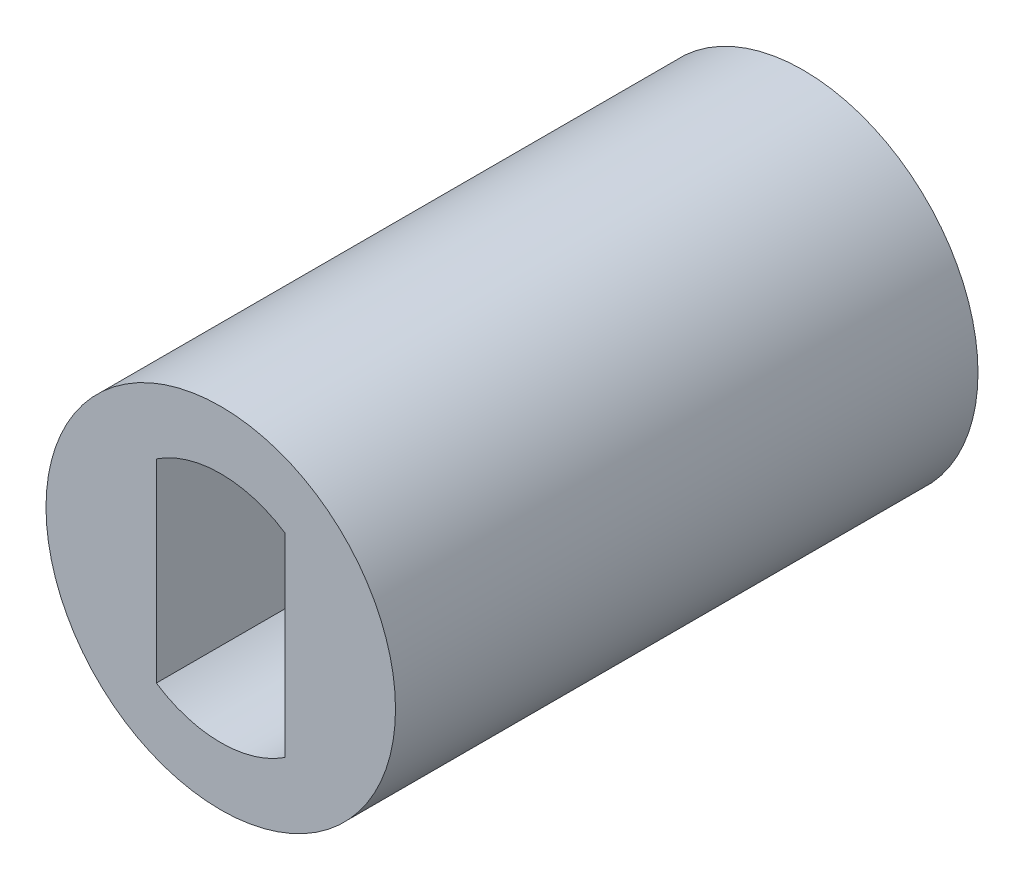
ISO-10303-21;
HEADER;
FILE_DESCRIPTION(('STEP AP214'),'2;1');
FILE_NAME('part.step','',(''),(''),'','','');
FILE_SCHEMA(('AUTOMOTIVE_DESIGN { 1 0 10303 214 1 1 1 1 }'));
ENDSEC;
DATA;
#1=APPLICATION_CONTEXT('core data for automotive mechanical design processes');
#2=APPLICATION_PROTOCOL_DEFINITION('international standard','automotive_design',2000,#1);
#3=PRODUCT_CONTEXT('',#1,'mechanical');
#4=PRODUCT('Part','Part','',(#3));
#5=PRODUCT_RELATED_PRODUCT_CATEGORY('part','',(#4));
#6=PRODUCT_DEFINITION_FORMATION('','',#4);
#7=PRODUCT_DEFINITION_CONTEXT('part definition',#1,'design');
#8=PRODUCT_DEFINITION('design','',#6,#7);
#9=PRODUCT_DEFINITION_SHAPE('','',#8);
#10=(LENGTH_UNIT() NAMED_UNIT(*) SI_UNIT(.MILLI.,.METRE.));
#11=(NAMED_UNIT(*) PLANE_ANGLE_UNIT() SI_UNIT($,.RADIAN.));
#12=(NAMED_UNIT(*) SI_UNIT($,.STERADIAN.) SOLID_ANGLE_UNIT());
#13=UNCERTAINTY_MEASURE_WITH_UNIT(LENGTH_MEASURE(1.E-05),#10,'distance_accuracy_value','');
#14=(GEOMETRIC_REPRESENTATION_CONTEXT(3) GLOBAL_UNCERTAINTY_ASSIGNED_CONTEXT((#13)) GLOBAL_UNIT_ASSIGNED_CONTEXT((#10,
#11,#12)) REPRESENTATION_CONTEXT('',''));
#15=CARTESIAN_POINT('',(0.,0.,0.));
#16=DIRECTION('',(0.,0.,1.));
#17=DIRECTION('',(1.,0.,0.));
#18=AXIS2_PLACEMENT_3D('',#15,#16,#17);
#19=CARTESIAN_POINT('',(0.,0.,30.));
#20=DIRECTION('',(0.,0.,-1.));
#21=DIRECTION('',(-1.,0.,0.));
#22=AXIS2_PLACEMENT_3D('',#19,#20,#21);
#23=CYLINDRICAL_SURFACE('',#22,6.);
#24=CARTESIAN_POINT('',(0.,0.,0.));
#25=DIRECTION('',(0.,0.,1.));
#26=DIRECTION('',(1.,0.,0.));
#27=AXIS2_PLACEMENT_3D('',#24,#25,#26);
#28=CIRCLE('',#27,6.);
#29=CARTESIAN_POINT('',(3.31662479035543,4.99999999999999,0.));
#30=VERTEX_POINT('',#29);
#31=CARTESIAN_POINT('',(-3.31662479035543,4.99999999999999,0.));
#32=VERTEX_POINT('',#31);
#33=EDGE_CURVE('E113',#30,#32,#28,.T.);
#34=ORIENTED_EDGE('',*,*,#33,.F.);
#35=DIRECTION('',(0.,0.,-1.));
#36=VECTOR('',#35,1.);
#37=CARTESIAN_POINT('',(3.31662479035543,4.99999999999999,30.));
#38=LINE('',#37,#36);
#39=CARTESIAN_POINT('',(3.31662479035543,4.99999999999999,30.));
#40=VERTEX_POINT('',#39);
#41=EDGE_CURVE('E11',#40,#30,#38,.T.);
#42=ORIENTED_EDGE('',*,*,#41,.F.);
#43=CARTESIAN_POINT('',(0.,0.,30.));
#44=DIRECTION('',(0.,0.,1.));
#45=DIRECTION('',(1.,0.,0.));
#46=AXIS2_PLACEMENT_3D('',#43,#44,#45);
#47=CIRCLE('',#46,6.);
#48=CARTESIAN_POINT('',(-3.31662479035543,4.99999999999999,30.));
#49=VERTEX_POINT('',#48);
#50=EDGE_CURVE('E84',#40,#49,#47,.T.);
#51=ORIENTED_EDGE('',*,*,#50,.T.);
#52=DIRECTION('',(0.,0.,-1.));
#53=VECTOR('',#52,1.);
#54=CARTESIAN_POINT('',(-3.31662479035543,4.99999999999999,30.));
#55=LINE('',#54,#53);
#56=EDGE_CURVE('E51',#49,#32,#55,.T.);
#57=ORIENTED_EDGE('',*,*,#56,.T.);
#58=EDGE_LOOP('',(#34,#42,#51,#57));
#59=FACE_BOUND('',#58,.T.);
#60=ADVANCED_FACE('F34',(#59),#23,.F.);
#61=CARTESIAN_POINT('',(3.31662479035543,0.,30.));
#62=DIRECTION('',(1.,0.,0.));
#63=DIRECTION('',(0.,0.,-1.));
#64=AXIS2_PLACEMENT_3D('',#61,#62,#63);
#65=PLANE('',#64);
#66=DIRECTION('',(0.,-1.,0.));
#67=VECTOR('',#66,1.);
#68=CARTESIAN_POINT('',(3.31662479035543,0.,0.));
#69=LINE('',#68,#67);
#70=CARTESIAN_POINT('',(3.31662479035543,-4.99999999999999,0.));
#71=VERTEX_POINT('',#70);
#72=EDGE_CURVE('E89',#30,#71,#69,.T.);
#73=ORIENTED_EDGE('',*,*,#72,.T.);
#74=DIRECTION('',(0.,0.,-1.));
#75=VECTOR('',#74,1.);
#76=CARTESIAN_POINT('',(3.31662479035543,-4.99999999999999,30.));
#77=LINE('',#76,#75);
#78=CARTESIAN_POINT('',(3.31662479035543,-4.99999999999999,30.));
#79=VERTEX_POINT('',#78);
#80=EDGE_CURVE('E43',#79,#71,#77,.T.);
#81=ORIENTED_EDGE('',*,*,#80,.F.);
#82=DIRECTION('',(0.,-1.,0.));
#83=VECTOR('',#82,1.);
#84=CARTESIAN_POINT('',(3.31662479035543,0.,30.));
#85=LINE('',#84,#83);
#86=EDGE_CURVE('E77',#40,#79,#85,.T.);
#87=ORIENTED_EDGE('',*,*,#86,.F.);
#88=ORIENTED_EDGE('',*,*,#41,.T.);
#89=EDGE_LOOP('',(#73,#81,#87,#88));
#90=FACE_BOUND('',#89,.T.);
#91=ADVANCED_FACE('F36',(#90),#65,.F.);
#92=CARTESIAN_POINT('',(-3.31662479035543,-4.99999999999999,0.));
#93=VERTEX_POINT('',#92);
#94=EDGE_CURVE('E104',#93,#71,#28,.T.);
#95=ORIENTED_EDGE('',*,*,#94,.F.);
#96=DIRECTION('',(0.,0.,-1.));
#97=VECTOR('',#96,1.);
#98=CARTESIAN_POINT('',(-3.31662479035543,-4.99999999999999,30.));
#99=LINE('',#98,#97);
#100=CARTESIAN_POINT('',(-3.31662479035543,-4.99999999999999,30.));
#101=VERTEX_POINT('',#100);
#102=EDGE_CURVE('E64',#101,#93,#99,.T.);
#103=ORIENTED_EDGE('',*,*,#102,.F.);
#104=EDGE_CURVE('E83',#101,#79,#47,.T.);
#105=ORIENTED_EDGE('',*,*,#104,.T.);
#106=ORIENTED_EDGE('',*,*,#80,.T.);
#107=EDGE_LOOP('',(#95,#103,#105,#106));
#108=FACE_BOUND('',#107,.T.);
#109=ADVANCED_FACE('F92',(#108),#23,.F.);
#110=CARTESIAN_POINT('',(-3.31662479035543,0.,30.));
#111=DIRECTION('',(1.,0.,0.));
#112=DIRECTION('',(0.,0.,-1.));
#113=AXIS2_PLACEMENT_3D('',#110,#111,#112);
#114=PLANE('',#113);
#115=DIRECTION('',(0.,-1.,0.));
#116=VECTOR('',#115,1.);
#117=CARTESIAN_POINT('',(-3.31662479035543,0.,0.));
#118=LINE('',#117,#116);
#119=EDGE_CURVE('E99',#32,#93,#118,.T.);
#120=ORIENTED_EDGE('',*,*,#119,.F.);
#121=ORIENTED_EDGE('',*,*,#56,.F.);
#122=DIRECTION('',(0.,-1.,0.));
#123=VECTOR('',#122,1.);
#124=CARTESIAN_POINT('',(-3.31662479035543,0.,30.));
#125=LINE('',#124,#123);
#126=EDGE_CURVE('E93',#49,#101,#125,.T.);
#127=ORIENTED_EDGE('',*,*,#126,.T.);
#128=ORIENTED_EDGE('',*,*,#102,.T.);
#129=EDGE_LOOP('',(#120,#121,#127,#128));
#130=FACE_BOUND('',#129,.T.);
#131=ADVANCED_FACE('F117',(#130),#114,.T.);
#132=CARTESIAN_POINT('',(0.,0.,30.));
#133=DIRECTION('',(0.,0.,-1.));
#134=DIRECTION('',(-1.,0.,0.));
#135=AXIS2_PLACEMENT_3D('',#132,#133,#134);
#136=CYLINDRICAL_SURFACE('',#135,9.00000000000001);
#137=CARTESIAN_POINT('',(0.,0.,30.));
#138=DIRECTION('',(0.,0.,1.));
#139=DIRECTION('',(1.,0.,0.));
#140=AXIS2_PLACEMENT_3D('',#137,#138,#139);
#141=CIRCLE('',#140,9.00000000000001);
#142=CARTESIAN_POINT('',(9.00000000000001,0.,30.));
#143=VERTEX_POINT('',#142);
#144=EDGE_CURVE('E95',#143,#143,#141,.T.);
#145=ORIENTED_EDGE('',*,*,#144,.F.);
#146=EDGE_LOOP('',(#145));
#147=FACE_BOUND('',#146,.T.);
#148=CARTESIAN_POINT('',(0.,0.,0.));
#149=DIRECTION('',(0.,0.,1.));
#150=DIRECTION('',(1.,0.,0.));
#151=AXIS2_PLACEMENT_3D('',#148,#149,#150);
#152=CIRCLE('',#151,9.00000000000001);
#153=CARTESIAN_POINT('',(9.00000000000001,0.,0.));
#154=VERTEX_POINT('',#153);
#155=EDGE_CURVE('E97',#154,#154,#152,.T.);
#156=ORIENTED_EDGE('',*,*,#155,.T.);
#157=EDGE_LOOP('',(#156));
#158=FACE_BOUND('',#157,.T.);
#159=ADVANCED_FACE('F119',(#147,#158),#136,.T.);
#160=CARTESIAN_POINT('',(0.,0.,30.));
#161=DIRECTION('',(0.,0.,1.));
#162=DIRECTION('',(1.,0.,0.));
#163=AXIS2_PLACEMENT_3D('',#160,#161,#162);
#164=PLANE('',#163);
#165=ORIENTED_EDGE('',*,*,#50,.F.);
#166=ORIENTED_EDGE('',*,*,#86,.T.);
#167=ORIENTED_EDGE('',*,*,#104,.F.);
#168=ORIENTED_EDGE('',*,*,#126,.F.);
#169=EDGE_LOOP('',(#165,#166,#167,#168));
#170=FACE_BOUND('',#169,.T.);
#171=ORIENTED_EDGE('',*,*,#144,.T.);
#172=EDGE_LOOP('',(#171));
#173=FACE_BOUND('',#172,.T.);
#174=ADVANCED_FACE('F79',(#170,#173),#164,.T.);
#175=CARTESIAN_POINT('',(0.,0.,0.));
#176=DIRECTION('',(0.,0.,1.));
#177=DIRECTION('',(1.,0.,0.));
#178=AXIS2_PLACEMENT_3D('',#175,#176,#177);
#179=PLANE('',#178);
#180=ORIENTED_EDGE('',*,*,#33,.T.);
#181=ORIENTED_EDGE('',*,*,#119,.T.);
#182=ORIENTED_EDGE('',*,*,#94,.T.);
#183=ORIENTED_EDGE('',*,*,#72,.F.);
#184=EDGE_LOOP('',(#180,#181,#182,#183));
#185=FACE_BOUND('',#184,.T.);
#186=ORIENTED_EDGE('',*,*,#155,.F.);
#187=EDGE_LOOP('',(#186));
#188=FACE_BOUND('',#187,.T.);
#189=ADVANCED_FACE('F115',(#185,#188),#179,.F.);
#190=CLOSED_SHELL('',(#60,#91,#109,#131,#159,#174,#189));
#191=MANIFOLD_SOLID_BREP('B2',#190);
#192=ADVANCED_BREP_SHAPE_REPRESENTATION('',(#18,#191),#14);
#193=SHAPE_DEFINITION_REPRESENTATION(#9,#192);
ENDSEC;
END-ISO-10303-21;
